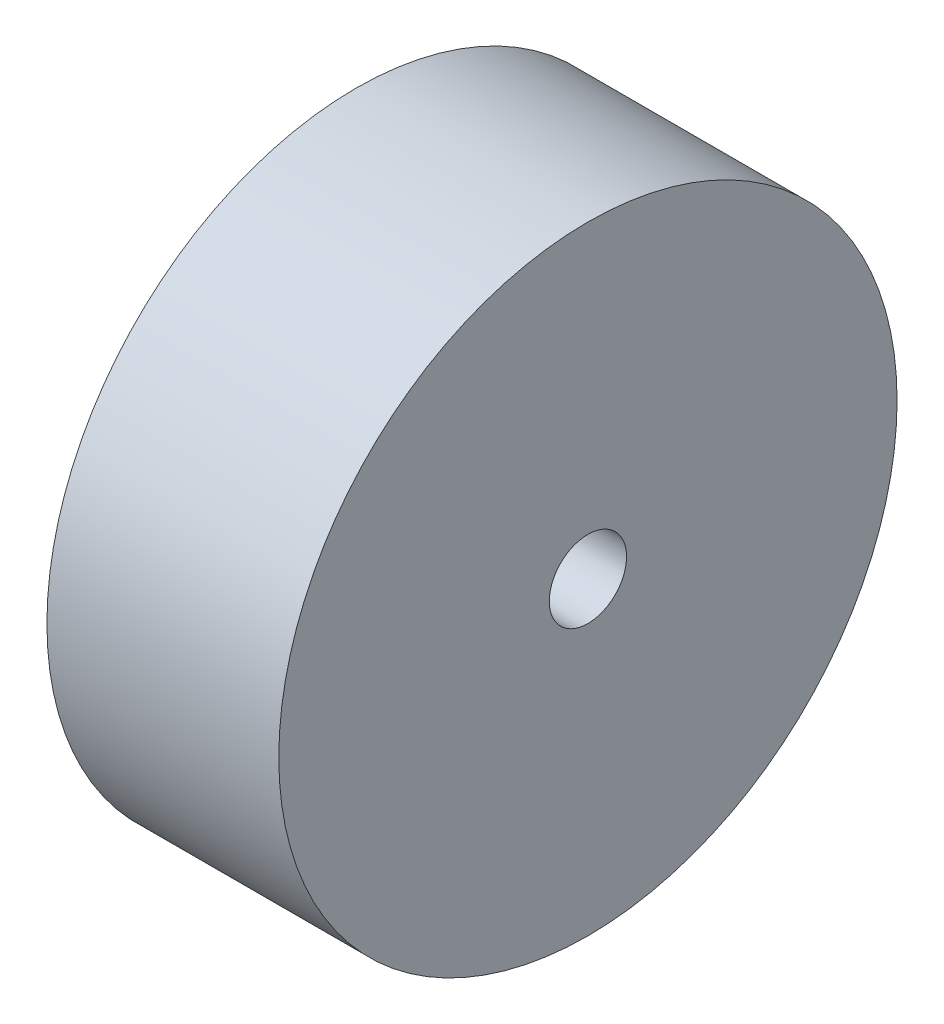
ISO-10303-21;
HEADER;
FILE_DESCRIPTION(('STEP AP214'),'2;1');
FILE_NAME('part.step','',(''),(''),'','','');
FILE_SCHEMA(('AUTOMOTIVE_DESIGN { 1 0 10303 214 1 1 1 1 }'));
ENDSEC;
DATA;
#1=APPLICATION_CONTEXT('core data for automotive mechanical design processes');
#2=APPLICATION_PROTOCOL_DEFINITION('international standard','automotive_design',2000,#1);
#3=PRODUCT_CONTEXT('',#1,'mechanical');
#4=PRODUCT('Part','Part','',(#3));
#5=PRODUCT_RELATED_PRODUCT_CATEGORY('part','',(#4));
#6=PRODUCT_DEFINITION_FORMATION('','',#4);
#7=PRODUCT_DEFINITION_CONTEXT('part definition',#1,'design');
#8=PRODUCT_DEFINITION('design','',#6,#7);
#9=PRODUCT_DEFINITION_SHAPE('','',#8);
#10=(LENGTH_UNIT() NAMED_UNIT(*) SI_UNIT(.MILLI.,.METRE.));
#11=(NAMED_UNIT(*) PLANE_ANGLE_UNIT() SI_UNIT($,.RADIAN.));
#12=(NAMED_UNIT(*) SI_UNIT($,.STERADIAN.) SOLID_ANGLE_UNIT());
#13=UNCERTAINTY_MEASURE_WITH_UNIT(LENGTH_MEASURE(1.E-05),#10,'distance_accuracy_value','');
#14=(GEOMETRIC_REPRESENTATION_CONTEXT(3) GLOBAL_UNCERTAINTY_ASSIGNED_CONTEXT((#13)) GLOBAL_UNIT_ASSIGNED_CONTEXT((#10,
#11,#12)) REPRESENTATION_CONTEXT('',''));
#15=CARTESIAN_POINT('',(0.,0.,0.));
#16=DIRECTION('',(0.,0.,1.));
#17=DIRECTION('',(1.,0.,0.));
#18=AXIS2_PLACEMENT_3D('',#15,#16,#17);
#19=CARTESIAN_POINT('',(76.2,0.,0.));
#20=DIRECTION('',(1.,0.,0.));
#21=DIRECTION('',(0.,0.,-1.));
#22=AXIS2_PLACEMENT_3D('',#19,#20,#21);
#23=PLANE('',#22);
#24=CARTESIAN_POINT('',(76.2,0.,0.));
#25=DIRECTION('',(1.,0.,0.));
#26=DIRECTION('',(0.,0.,-1.));
#27=AXIS2_PLACEMENT_3D('',#24,#25,#26);
#28=CIRCLE('',#27,101.6);
#29=CARTESIAN_POINT('',(76.2,0.,101.6));
#30=VERTEX_POINT('',#29);
#31=EDGE_CURVE('E10',#30,#30,#28,.T.);
#32=ORIENTED_EDGE('',*,*,#31,.T.);
#33=EDGE_LOOP('',(#32));
#34=FACE_BOUND('',#33,.T.);
#35=CARTESIAN_POINT('',(76.2,0.,0.));
#36=DIRECTION('',(1.,0.,0.));
#37=DIRECTION('',(0.,0.,-1.));
#38=AXIS2_PLACEMENT_3D('',#35,#36,#37);
#39=CIRCLE('',#38,12.7);
#40=CARTESIAN_POINT('',(76.2,0.,12.7));
#41=VERTEX_POINT('',#40);
#42=EDGE_CURVE('E50',#41,#41,#39,.T.);
#43=ORIENTED_EDGE('',*,*,#42,.F.);
#44=EDGE_LOOP('',(#43));
#45=FACE_BOUND('',#44,.T.);
#46=ADVANCED_FACE('F39',(#34,#45),#23,.T.);
#47=CARTESIAN_POINT('',(0.,0.,0.));
#48=DIRECTION('',(1.,0.,0.));
#49=DIRECTION('',(0.,0.,-1.));
#50=AXIS2_PLACEMENT_3D('',#47,#48,#49);
#51=PLANE('',#50);
#52=CARTESIAN_POINT('',(0.,0.,0.));
#53=DIRECTION('',(1.,0.,0.));
#54=DIRECTION('',(0.,0.,-1.));
#55=AXIS2_PLACEMENT_3D('',#52,#53,#54);
#56=CIRCLE('',#55,101.6);
#57=CARTESIAN_POINT('',(0.,0.,101.6));
#58=VERTEX_POINT('',#57);
#59=EDGE_CURVE('E43',#58,#58,#56,.T.);
#60=ORIENTED_EDGE('',*,*,#59,.F.);
#61=EDGE_LOOP('',(#60));
#62=FACE_BOUND('',#61,.T.);
#63=CARTESIAN_POINT('',(0.,0.,0.));
#64=DIRECTION('',(1.,0.,0.));
#65=DIRECTION('',(0.,0.,-1.));
#66=AXIS2_PLACEMENT_3D('',#63,#64,#65);
#67=CIRCLE('',#66,12.7);
#68=CARTESIAN_POINT('',(0.,0.,12.7));
#69=VERTEX_POINT('',#68);
#70=EDGE_CURVE('E52',#69,#69,#67,.T.);
#71=ORIENTED_EDGE('',*,*,#70,.T.);
#72=EDGE_LOOP('',(#71));
#73=FACE_BOUND('',#72,.T.);
#74=ADVANCED_FACE('F62',(#62,#73),#51,.F.);
#75=CARTESIAN_POINT('',(76.2,0.,0.));
#76=DIRECTION('',(-1.,0.,0.));
#77=DIRECTION('',(0.,0.,1.));
#78=AXIS2_PLACEMENT_3D('',#75,#76,#77);
#79=CYLINDRICAL_SURFACE('',#78,101.6);
#80=CARTESIAN_POINT('',(76.2,0.,101.6));
#81=CARTESIAN_POINT('',(75.40625,0.,101.6));
#82=CARTESIAN_POINT('',(74.6125,0.,101.6));
#83=CARTESIAN_POINT('',(73.025,0.,101.6));
#84=CARTESIAN_POINT('',(72.23125,0.,101.6));
#85=CARTESIAN_POINT('',(70.64375,0.,101.6));
#86=CARTESIAN_POINT('',(69.85,0.,101.6));
#87=CARTESIAN_POINT('',(68.2625,0.,101.6));
#88=CARTESIAN_POINT('',(67.46875,0.,101.6));
#89=CARTESIAN_POINT('',(65.88125,0.,101.6));
#90=CARTESIAN_POINT('',(65.0875,0.,101.6));
#91=CARTESIAN_POINT('',(63.5,0.,101.6));
#92=CARTESIAN_POINT('',(62.70625,0.,101.6));
#93=CARTESIAN_POINT('',(61.11875,0.,101.6));
#94=CARTESIAN_POINT('',(60.325,0.,101.6));
#95=CARTESIAN_POINT('',(58.7375,0.,101.6));
#96=CARTESIAN_POINT('',(57.94375,0.,101.6));
#97=CARTESIAN_POINT('',(56.35625,0.,101.6));
#98=CARTESIAN_POINT('',(55.5625,0.,101.6));
#99=CARTESIAN_POINT('',(53.975,0.,101.6));
#100=CARTESIAN_POINT('',(53.18125,0.,101.6));
#101=CARTESIAN_POINT('',(51.59375,0.,101.6));
#102=CARTESIAN_POINT('',(50.8,0.,101.6));
#103=CARTESIAN_POINT('',(49.2125,0.,101.6));
#104=CARTESIAN_POINT('',(48.41875,0.,101.6));
#105=CARTESIAN_POINT('',(46.83125,0.,101.6));
#106=CARTESIAN_POINT('',(46.0375,0.,101.6));
#107=CARTESIAN_POINT('',(44.45,0.,101.6));
#108=CARTESIAN_POINT('',(43.65625,0.,101.6));
#109=CARTESIAN_POINT('',(42.06875,0.,101.6));
#110=CARTESIAN_POINT('',(41.275,0.,101.6));
#111=CARTESIAN_POINT('',(39.6875,0.,101.6));
#112=CARTESIAN_POINT('',(38.89375,0.,101.6));
#113=CARTESIAN_POINT('',(37.30625,0.,101.6));
#114=CARTESIAN_POINT('',(36.5125,0.,101.6));
#115=CARTESIAN_POINT('',(34.925,0.,101.6));
#116=CARTESIAN_POINT('',(34.13125,0.,101.6));
#117=CARTESIAN_POINT('',(32.54375,0.,101.6));
#118=CARTESIAN_POINT('',(31.75,0.,101.6));
#119=CARTESIAN_POINT('',(30.1625,0.,101.6));
#120=CARTESIAN_POINT('',(29.36875,0.,101.6));
#121=CARTESIAN_POINT('',(27.78125,0.,101.6));
#122=CARTESIAN_POINT('',(26.9875,0.,101.6));
#123=CARTESIAN_POINT('',(25.4,0.,101.6));
#124=CARTESIAN_POINT('',(24.60625,0.,101.6));
#125=CARTESIAN_POINT('',(23.01875,0.,101.6));
#126=CARTESIAN_POINT('',(22.225,0.,101.6));
#127=CARTESIAN_POINT('',(20.6375,0.,101.6));
#128=CARTESIAN_POINT('',(19.84375,0.,101.6));
#129=CARTESIAN_POINT('',(18.25625,0.,101.6));
#130=CARTESIAN_POINT('',(17.4625,0.,101.6));
#131=CARTESIAN_POINT('',(15.875,0.,101.6));
#132=CARTESIAN_POINT('',(15.08125,0.,101.6));
#133=CARTESIAN_POINT('',(13.49375,0.,101.6));
#134=CARTESIAN_POINT('',(12.7,0.,101.6));
#135=CARTESIAN_POINT('',(11.1125,0.,101.6));
#136=CARTESIAN_POINT('',(10.31875,0.,101.6));
#137=CARTESIAN_POINT('',(8.73125,0.,101.6));
#138=CARTESIAN_POINT('',(7.93750000000001,0.,101.6));
#139=CARTESIAN_POINT('',(6.35,0.,101.6));
#140=CARTESIAN_POINT('',(5.55625,0.,101.6));
#141=CARTESIAN_POINT('',(3.96875,0.,101.6));
#142=CARTESIAN_POINT('',(3.175,0.,101.6));
#143=CARTESIAN_POINT('',(1.5875,0.,101.6));
#144=CARTESIAN_POINT('',(0.793750000000001,0.,101.6));
#145=CARTESIAN_POINT('',(0.,0.,101.6));
#146=B_SPLINE_CURVE_WITH_KNOTS('',3,(#80,#81,#82,#83,#84,#85,#86,#87,#88,#89,#90,#91,#92,#93,
#94,#95,#96,#97,#98,#99,#100,#101,#102,#103,#104,#105,#106,#107,#108,#109,#110,#111,#112,#113,
#114,#115,#116,#117,#118,#119,#120,#121,#122,#123,#124,#125,#126,#127,#128,#129,#130,#131,#132,
#133,#134,#135,#136,#137,#138,#139,#140,#141,#142,#143,#144,#145),.UNSPECIFIED.,.F.,.F.,(4,2,2,
2,2,2,2,2,2,2,2,2,2,2,2,2,2,2,2,2,2,2,2,2,2,2,2,2,2,2,2,2,4),(0.,2.38125,4.7625,7.14375,
9.52500000000001,11.90625,14.2875,16.66875,19.05,21.43125,23.8125,26.19375,28.575,30.95625,
33.3375,35.71875,38.1,40.48125,42.8625,45.24375,47.625,50.00625,52.3875,54.76875,57.15,59.53125,
61.9125,64.29375,66.675,69.05625,71.4375,73.81875,76.2),.UNSPECIFIED.);
#147=EDGE_CURVE('BSEAM41',#30,#58,#146,.T.);
#148=ORIENTED_EDGE('',*,*,#31,.F.);
#149=ORIENTED_EDGE('',*,*,#59,.T.);
#150=ORIENTED_EDGE('',*,*,#147,.T.);
#151=ORIENTED_EDGE('',*,*,#147,.F.);
#152=EDGE_LOOP('',(#148,#150,#149,#151));
#153=FACE_BOUND('',#152,.T.);
#154=ADVANCED_FACE('F41',(#153),#79,.T.);
#155=CARTESIAN_POINT('',(76.2,0.,0.));
#156=DIRECTION('',(-1.,0.,0.));
#157=DIRECTION('',(0.,0.,1.));
#158=AXIS2_PLACEMENT_3D('',#155,#156,#157);
#159=CYLINDRICAL_SURFACE('',#158,12.7);
#160=CARTESIAN_POINT('',(76.2,0.,12.7));
#161=CARTESIAN_POINT('',(75.40625,0.,12.7));
#162=CARTESIAN_POINT('',(74.6125,0.,12.7));
#163=CARTESIAN_POINT('',(73.025,0.,12.7));
#164=CARTESIAN_POINT('',(72.23125,0.,12.7));
#165=CARTESIAN_POINT('',(70.64375,0.,12.7));
#166=CARTESIAN_POINT('',(69.85,0.,12.7));
#167=CARTESIAN_POINT('',(68.2625,0.,12.7));
#168=CARTESIAN_POINT('',(67.46875,0.,12.7));
#169=CARTESIAN_POINT('',(65.88125,0.,12.7));
#170=CARTESIAN_POINT('',(65.0875,0.,12.7));
#171=CARTESIAN_POINT('',(63.5,0.,12.7));
#172=CARTESIAN_POINT('',(62.70625,0.,12.7));
#173=CARTESIAN_POINT('',(61.11875,0.,12.7));
#174=CARTESIAN_POINT('',(60.325,0.,12.7));
#175=CARTESIAN_POINT('',(58.7375,0.,12.7));
#176=CARTESIAN_POINT('',(57.94375,0.,12.7));
#177=CARTESIAN_POINT('',(56.35625,0.,12.7));
#178=CARTESIAN_POINT('',(55.5625,0.,12.7));
#179=CARTESIAN_POINT('',(53.975,0.,12.7));
#180=CARTESIAN_POINT('',(53.18125,0.,12.7));
#181=CARTESIAN_POINT('',(51.59375,0.,12.7));
#182=CARTESIAN_POINT('',(50.8,0.,12.7));
#183=CARTESIAN_POINT('',(49.2125,0.,12.7));
#184=CARTESIAN_POINT('',(48.41875,0.,12.7));
#185=CARTESIAN_POINT('',(46.83125,0.,12.7));
#186=CARTESIAN_POINT('',(46.0375,0.,12.7));
#187=CARTESIAN_POINT('',(44.45,0.,12.7));
#188=CARTESIAN_POINT('',(43.65625,0.,12.7));
#189=CARTESIAN_POINT('',(42.06875,0.,12.7));
#190=CARTESIAN_POINT('',(41.275,0.,12.7));
#191=CARTESIAN_POINT('',(39.6875,0.,12.7));
#192=CARTESIAN_POINT('',(38.89375,0.,12.7));
#193=CARTESIAN_POINT('',(37.30625,0.,12.7));
#194=CARTESIAN_POINT('',(36.5125,0.,12.7));
#195=CARTESIAN_POINT('',(34.925,0.,12.7));
#196=CARTESIAN_POINT('',(34.13125,0.,12.7));
#197=CARTESIAN_POINT('',(32.54375,0.,12.7));
#198=CARTESIAN_POINT('',(31.75,0.,12.7));
#199=CARTESIAN_POINT('',(30.1625,0.,12.7));
#200=CARTESIAN_POINT('',(29.36875,0.,12.7));
#201=CARTESIAN_POINT('',(27.78125,0.,12.7));
#202=CARTESIAN_POINT('',(26.9875,0.,12.7));
#203=CARTESIAN_POINT('',(25.4,0.,12.7));
#204=CARTESIAN_POINT('',(24.60625,0.,12.7));
#205=CARTESIAN_POINT('',(23.01875,0.,12.7));
#206=CARTESIAN_POINT('',(22.225,0.,12.7));
#207=CARTESIAN_POINT('',(20.6375,0.,12.7));
#208=CARTESIAN_POINT('',(19.84375,0.,12.7));
#209=CARTESIAN_POINT('',(18.25625,0.,12.7));
#210=CARTESIAN_POINT('',(17.4625,0.,12.7));
#211=CARTESIAN_POINT('',(15.875,0.,12.7));
#212=CARTESIAN_POINT('',(15.08125,0.,12.7));
#213=CARTESIAN_POINT('',(13.49375,0.,12.7));
#214=CARTESIAN_POINT('',(12.7,0.,12.7));
#215=CARTESIAN_POINT('',(11.1125,0.,12.7));
#216=CARTESIAN_POINT('',(10.31875,0.,12.7));
#217=CARTESIAN_POINT('',(8.73125,0.,12.7));
#218=CARTESIAN_POINT('',(7.93750000000001,0.,12.7));
#219=CARTESIAN_POINT('',(6.35,0.,12.7));
#220=CARTESIAN_POINT('',(5.55625,0.,12.7));
#221=CARTESIAN_POINT('',(3.96875,0.,12.7));
#222=CARTESIAN_POINT('',(3.175,0.,12.7));
#223=CARTESIAN_POINT('',(1.5875,0.,12.7));
#224=CARTESIAN_POINT('',(0.793750000000001,0.,12.7));
#225=CARTESIAN_POINT('',(0.,0.,12.7));
#226=B_SPLINE_CURVE_WITH_KNOTS('',3,(#160,#161,#162,#163,#164,#165,#166,#167,#168,#169,#170,
#171,#172,#173,#174,#175,#176,#177,#178,#179,#180,#181,#182,#183,#184,#185,#186,#187,#188,#189,
#190,#191,#192,#193,#194,#195,#196,#197,#198,#199,#200,#201,#202,#203,#204,#205,#206,#207,#208,
#209,#210,#211,#212,#213,#214,#215,#216,#217,#218,#219,#220,#221,#222,#223,#224,#225),
.UNSPECIFIED.,.F.,.F.,(4,2,2,2,2,2,2,2,2,2,2,2,2,2,2,2,2,2,2,2,2,2,2,2,2,2,2,2,2,2,2,2,4),(0.,
2.38124999999999,4.76249999999999,7.14374999999999,9.52499999999999,11.90625,14.2875,16.66875,
19.05,21.43125,23.8125,26.19375,28.575,30.95625,33.3375,35.71875,38.1,40.48125,42.8625,45.24375,
47.625,50.00625,52.3875,54.76875,57.15,59.53125,61.9125,64.29375,66.675,69.05625,71.4375,
73.81875,76.2),.UNSPECIFIED.);
#227=EDGE_CURVE('BSEAM58',#41,#69,#226,.T.);
#228=ORIENTED_EDGE('',*,*,#42,.T.);
#229=ORIENTED_EDGE('',*,*,#70,.F.);
#230=ORIENTED_EDGE('',*,*,#227,.T.);
#231=ORIENTED_EDGE('',*,*,#227,.F.);
#232=EDGE_LOOP('',(#228,#230,#229,#231));
#233=FACE_BOUND('',#232,.T.);
#234=ADVANCED_FACE('F58',(#233),#159,.F.);
#235=CLOSED_SHELL('',(#46,#74,#154,#234));
#236=MANIFOLD_SOLID_BREP('B2',#235);
#237=ADVANCED_BREP_SHAPE_REPRESENTATION('',(#18,#236),#14);
#238=SHAPE_DEFINITION_REPRESENTATION(#9,#237);
ENDSEC;
END-ISO-10303-21;
